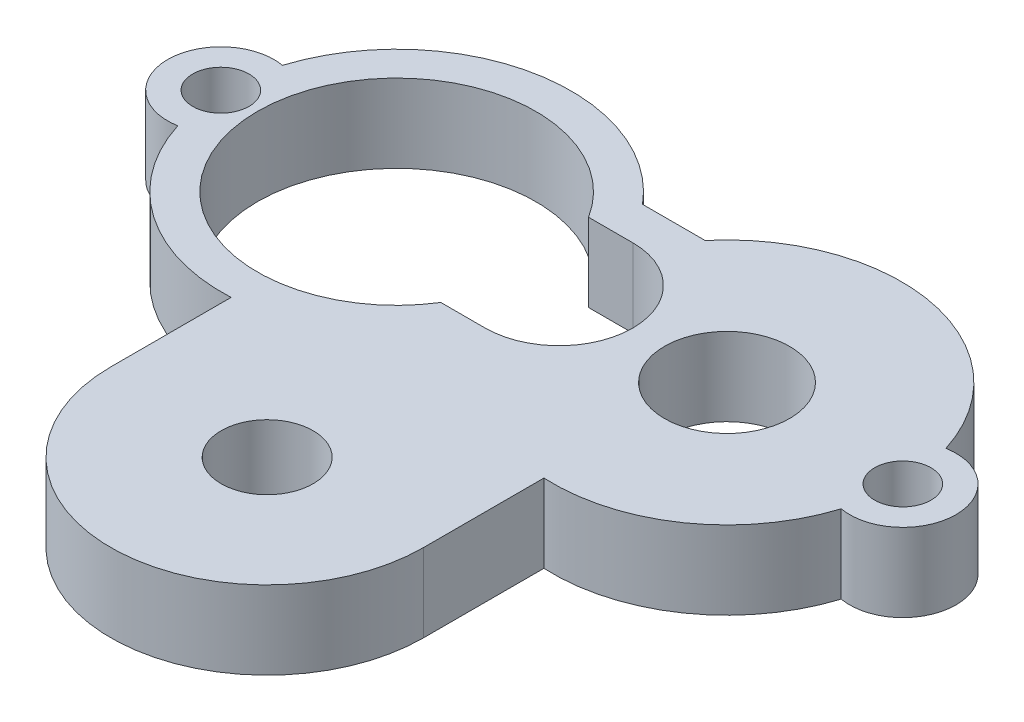
ISO-10303-21;
HEADER;
FILE_DESCRIPTION(('STEP AP214'),'2;1');
FILE_NAME('part.step','',(''),(''),'','','');
FILE_SCHEMA(('AUTOMOTIVE_DESIGN { 1 0 10303 214 1 1 1 1 }'));
ENDSEC;
DATA;
#1=APPLICATION_CONTEXT('core data for automotive mechanical design processes');
#2=APPLICATION_PROTOCOL_DEFINITION('international standard','automotive_design',2000,#1);
#3=PRODUCT_CONTEXT('',#1,'mechanical');
#4=PRODUCT('Part','Part','',(#3));
#5=PRODUCT_RELATED_PRODUCT_CATEGORY('part','',(#4));
#6=PRODUCT_DEFINITION_FORMATION('','',#4);
#7=PRODUCT_DEFINITION_CONTEXT('part definition',#1,'design');
#8=PRODUCT_DEFINITION('design','',#6,#7);
#9=PRODUCT_DEFINITION_SHAPE('','',#8);
#10=(LENGTH_UNIT() NAMED_UNIT(*) SI_UNIT(.MILLI.,.METRE.));
#11=(NAMED_UNIT(*) PLANE_ANGLE_UNIT() SI_UNIT($,.RADIAN.));
#12=(NAMED_UNIT(*) SI_UNIT($,.STERADIAN.) SOLID_ANGLE_UNIT());
#13=UNCERTAINTY_MEASURE_WITH_UNIT(LENGTH_MEASURE(1.E-05),#10,'distance_accuracy_value','');
#14=(GEOMETRIC_REPRESENTATION_CONTEXT(3) GLOBAL_UNCERTAINTY_ASSIGNED_CONTEXT((#13)) GLOBAL_UNIT_ASSIGNED_CONTEXT((#10,
#11,#12)) REPRESENTATION_CONTEXT('',''));
#15=CARTESIAN_POINT('',(0.,0.,0.));
#16=DIRECTION('',(0.,0.,1.));
#17=DIRECTION('',(1.,0.,0.));
#18=AXIS2_PLACEMENT_3D('',#15,#16,#17);
#19=CARTESIAN_POINT('',(13.843,3.175,-11.9634));
#20=DIRECTION('',(0.,-1.,0.));
#21=DIRECTION('',(0.,0.,-1.));
#22=AXIS2_PLACEMENT_3D('',#19,#20,#21);
#23=CYLINDRICAL_SURFACE('',#22,2.159);
#24=CARTESIAN_POINT('',(13.843,0.,-11.9634));
#25=DIRECTION('',(0.,1.,0.));
#26=DIRECTION('',(0.,0.,1.));
#27=AXIS2_PLACEMENT_3D('',#24,#25,#26);
#28=CIRCLE('',#27,2.159);
#29=CARTESIAN_POINT('',(13.4660664748785,0.,-14.0892415081185));
#30=VERTEX_POINT('',#29);
#31=CARTESIAN_POINT('',(13.4660664748786,0.,-9.83755849188153));
#32=VERTEX_POINT('',#31);
#33=EDGE_CURVE('E223',#30,#32,#28,.F.);
#34=ORIENTED_EDGE('',*,*,#33,.F.);
#35=DIRECTION('',(0.,-1.,0.));
#36=VECTOR('',#35,1.);
#37=CARTESIAN_POINT('',(13.4660664748785,3.175,-14.0892415081185));
#38=LINE('',#37,#36);
#39=CARTESIAN_POINT('',(13.4660664748785,3.175,-14.0892415081185));
#40=VERTEX_POINT('',#39);
#41=EDGE_CURVE('E11',#40,#30,#38,.T.);
#42=ORIENTED_EDGE('',*,*,#41,.F.);
#43=CARTESIAN_POINT('',(13.843,3.175,-11.9634));
#44=DIRECTION('',(0.,1.,0.));
#45=DIRECTION('',(0.,0.,1.));
#46=AXIS2_PLACEMENT_3D('',#43,#44,#45);
#47=CIRCLE('',#46,2.159);
#48=CARTESIAN_POINT('',(13.4660664748786,3.175,-9.83755849188153));
#49=VERTEX_POINT('',#48);
#50=EDGE_CURVE('E187',#40,#49,#47,.F.);
#51=ORIENTED_EDGE('',*,*,#50,.T.);
#52=DIRECTION('',(0.,-1.,0.));
#53=VECTOR('',#52,1.);
#54=CARTESIAN_POINT('',(13.4660664748786,3.175,-9.83755849188153));
#55=LINE('',#54,#53);
#56=EDGE_CURVE('E214',#49,#32,#55,.T.);
#57=ORIENTED_EDGE('',*,*,#56,.T.);
#58=EDGE_LOOP('',(#34,#42,#51,#57));
#59=FACE_BOUND('',#58,.T.);
#60=ADVANCED_FACE('F36',(#59),#23,.T.);
#61=CARTESIAN_POINT('',(6.70583737799431,3.175,-11.9634));
#62=DIRECTION('',(0.,-1.,0.));
#63=DIRECTION('',(0.,0.,-1.));
#64=AXIS2_PLACEMENT_3D('',#61,#62,#63);
#65=CYLINDRICAL_SURFACE('',#64,7.0866);
#66=CARTESIAN_POINT('',(6.70583737799431,0.,-11.9634));
#67=DIRECTION('',(0.,1.,0.));
#68=DIRECTION('',(0.,0.,1.));
#69=AXIS2_PLACEMENT_3D('',#66,#67,#68);
#70=CIRCLE('',#69,7.0866);
#71=CARTESIAN_POINT('',(1.27,0.,-16.51));
#72=VERTEX_POINT('',#71);
#73=EDGE_CURVE('E226',#30,#72,#70,.T.);
#74=ORIENTED_EDGE('',*,*,#73,.T.);
#75=DIRECTION('',(0.,-1.,0.));
#76=VECTOR('',#75,1.);
#77=CARTESIAN_POINT('',(1.27,3.175,-16.51));
#78=LINE('',#77,#76);
#79=CARTESIAN_POINT('',(1.27,3.175,-16.51));
#80=VERTEX_POINT('',#79);
#81=EDGE_CURVE('E44',#80,#72,#78,.T.);
#82=ORIENTED_EDGE('',*,*,#81,.F.);
#83=CARTESIAN_POINT('',(6.70583737799431,3.175,-11.9634));
#84=DIRECTION('',(0.,1.,0.));
#85=DIRECTION('',(0.,0.,1.));
#86=AXIS2_PLACEMENT_3D('',#83,#84,#85);
#87=CIRCLE('',#86,7.0866);
#88=EDGE_CURVE('E190',#40,#80,#87,.T.);
#89=ORIENTED_EDGE('',*,*,#88,.F.);
#90=ORIENTED_EDGE('',*,*,#41,.T.);
#91=EDGE_LOOP('',(#74,#82,#89,#90));
#92=FACE_BOUND('',#91,.T.);
#93=ADVANCED_FACE('F276',(#92),#65,.T.);
#94=CARTESIAN_POINT('',(0.,3.175,-16.51));
#95=DIRECTION('',(0.,0.,-1.));
#96=DIRECTION('',(-1.,0.,0.));
#97=AXIS2_PLACEMENT_3D('',#94,#95,#96);
#98=PLANE('',#97);
#99=DIRECTION('',(1.,0.,0.));
#100=VECTOR('',#99,1.);
#101=CARTESIAN_POINT('',(0.,0.,-16.51));
#102=LINE('',#101,#100);
#103=CARTESIAN_POINT('',(-1.27,0.,-16.51));
#104=VERTEX_POINT('',#103);
#105=EDGE_CURVE('E229',#104,#72,#102,.T.);
#106=ORIENTED_EDGE('',*,*,#105,.F.);
#107=DIRECTION('',(0.,-1.,0.));
#108=VECTOR('',#107,1.);
#109=CARTESIAN_POINT('',(-1.27,3.175,-16.51));
#110=LINE('',#109,#108);
#111=CARTESIAN_POINT('',(-1.27,3.175,-16.51));
#112=VERTEX_POINT('',#111);
#113=EDGE_CURVE('E267',#112,#104,#110,.T.);
#114=ORIENTED_EDGE('',*,*,#113,.F.);
#115=DIRECTION('',(1.,0.,0.));
#116=VECTOR('',#115,1.);
#117=CARTESIAN_POINT('',(0.,3.175,-16.51));
#118=LINE('',#117,#116);
#119=EDGE_CURVE('E192',#112,#80,#118,.T.);
#120=ORIENTED_EDGE('',*,*,#119,.T.);
#121=ORIENTED_EDGE('',*,*,#81,.T.);
#122=EDGE_LOOP('',(#106,#114,#120,#121));
#123=FACE_BOUND('',#122,.T.);
#124=ADVANCED_FACE('F271',(#123),#98,.T.);
#125=CARTESIAN_POINT('',(-6.70583737799431,3.175,-11.9634));
#126=DIRECTION('',(0.,-1.,0.));
#127=DIRECTION('',(0.,0.,-1.));
#128=AXIS2_PLACEMENT_3D('',#125,#126,#127);
#129=CYLINDRICAL_SURFACE('',#128,7.0866);
#130=CARTESIAN_POINT('',(-6.70583737799431,0.,-11.9634));
#131=DIRECTION('',(0.,1.,0.));
#132=DIRECTION('',(0.,0.,1.));
#133=AXIS2_PLACEMENT_3D('',#130,#131,#132);
#134=CIRCLE('',#133,7.0866);
#135=CARTESIAN_POINT('',(-13.4660664748785,0.,-14.0892415081185));
#136=VERTEX_POINT('',#135);
#137=EDGE_CURVE('E232',#136,#104,#134,.F.);
#138=ORIENTED_EDGE('',*,*,#137,.F.);
#139=DIRECTION('',(0.,-1.,0.));
#140=VECTOR('',#139,1.);
#141=CARTESIAN_POINT('',(-13.4660664748785,3.175,-14.0892415081185));
#142=LINE('',#141,#140);
#143=CARTESIAN_POINT('',(-13.4660664748785,3.175,-14.0892415081185));
#144=VERTEX_POINT('',#143);
#145=EDGE_CURVE('E265',#144,#136,#142,.T.);
#146=ORIENTED_EDGE('',*,*,#145,.F.);
#147=CARTESIAN_POINT('',(-6.70583737799431,3.175,-11.9634));
#148=DIRECTION('',(0.,1.,0.));
#149=DIRECTION('',(0.,0.,1.));
#150=AXIS2_PLACEMENT_3D('',#147,#148,#149);
#151=CIRCLE('',#150,7.0866);
#152=EDGE_CURVE('E195',#144,#112,#151,.F.);
#153=ORIENTED_EDGE('',*,*,#152,.T.);
#154=ORIENTED_EDGE('',*,*,#113,.T.);
#155=EDGE_LOOP('',(#138,#146,#153,#154));
#156=FACE_BOUND('',#155,.T.);
#157=ADVANCED_FACE('F282',(#156),#129,.T.);
#158=CARTESIAN_POINT('',(-13.843,3.175,-11.9634));
#159=DIRECTION('',(0.,-1.,0.));
#160=DIRECTION('',(0.,0.,-1.));
#161=AXIS2_PLACEMENT_3D('',#158,#159,#160);
#162=CYLINDRICAL_SURFACE('',#161,2.159);
#163=CARTESIAN_POINT('',(-13.843,0.,-11.9634));
#164=DIRECTION('',(0.,1.,0.));
#165=DIRECTION('',(0.,0.,1.));
#166=AXIS2_PLACEMENT_3D('',#163,#164,#165);
#167=CIRCLE('',#166,2.159);
#168=CARTESIAN_POINT('',(-13.4660664748786,0.,-9.83755849188152));
#169=VERTEX_POINT('',#168);
#170=EDGE_CURVE('E235',#136,#169,#167,.T.);
#171=ORIENTED_EDGE('',*,*,#170,.T.);
#172=DIRECTION('',(0.,-1.,0.));
#173=VECTOR('',#172,1.);
#174=CARTESIAN_POINT('',(-13.4660664748786,3.175,-9.83755849188152));
#175=LINE('',#174,#173);
#176=CARTESIAN_POINT('',(-13.4660664748786,3.175,-9.83755849188152));
#177=VERTEX_POINT('',#176);
#178=EDGE_CURVE('E263',#177,#169,#175,.T.);
#179=ORIENTED_EDGE('',*,*,#178,.F.);
#180=CARTESIAN_POINT('',(-13.843,3.175,-11.9634));
#181=DIRECTION('',(0.,1.,0.));
#182=DIRECTION('',(0.,0.,1.));
#183=AXIS2_PLACEMENT_3D('',#180,#181,#182);
#184=CIRCLE('',#183,2.159);
#185=EDGE_CURVE('E198',#144,#177,#184,.T.);
#186=ORIENTED_EDGE('',*,*,#185,.F.);
#187=ORIENTED_EDGE('',*,*,#145,.T.);
#188=EDGE_LOOP('',(#171,#179,#186,#187));
#189=FACE_BOUND('',#188,.T.);
#190=ADVANCED_FACE('F310',(#189),#162,.T.);
#191=CARTESIAN_POINT('',(-6.70583737799431,3.175,-11.9634));
#192=DIRECTION('',(0.,-1.,0.));
#193=DIRECTION('',(0.,0.,-1.));
#194=AXIS2_PLACEMENT_3D('',#191,#192,#193);
#195=CYLINDRICAL_SURFACE('',#194,7.0866);
#196=CARTESIAN_POINT('',(-6.70583737799431,0.,-11.9634));
#197=DIRECTION('',(0.,1.,0.));
#198=DIRECTION('',(0.,0.,1.));
#199=AXIS2_PLACEMENT_3D('',#196,#197,#198);
#200=CIRCLE('',#199,7.0866);
#201=CARTESIAN_POINT('',(-6.35,0.,-4.88573941754606));
#202=VERTEX_POINT('',#201);
#203=EDGE_CURVE('E238',#202,#169,#200,.F.);
#204=ORIENTED_EDGE('',*,*,#203,.F.);
#205=DIRECTION('',(0.,-1.,0.));
#206=VECTOR('',#205,1.);
#207=CARTESIAN_POINT('',(-6.35,3.175,-4.88573941754606));
#208=LINE('',#207,#206);
#209=CARTESIAN_POINT('',(-6.35,3.175,-4.88573941754606));
#210=VERTEX_POINT('',#209);
#211=EDGE_CURVE('E261',#210,#202,#208,.T.);
#212=ORIENTED_EDGE('',*,*,#211,.F.);
#213=CARTESIAN_POINT('',(-6.70583737799431,3.175,-11.9634));
#214=DIRECTION('',(0.,1.,0.));
#215=DIRECTION('',(0.,0.,1.));
#216=AXIS2_PLACEMENT_3D('',#213,#214,#215);
#217=CIRCLE('',#216,7.0866);
#218=EDGE_CURVE('E200',#210,#177,#217,.F.);
#219=ORIENTED_EDGE('',*,*,#218,.T.);
#220=ORIENTED_EDGE('',*,*,#178,.T.);
#221=EDGE_LOOP('',(#204,#212,#219,#220));
#222=FACE_BOUND('',#221,.T.);
#223=ADVANCED_FACE('F307',(#222),#195,.T.);
#224=CARTESIAN_POINT('',(-6.35,3.175,0.));
#225=DIRECTION('',(-1.,0.,0.));
#226=DIRECTION('',(0.,0.,1.));
#227=AXIS2_PLACEMENT_3D('',#224,#225,#226);
#228=PLANE('',#227);
#229=DIRECTION('',(0.,0.,-1.));
#230=VECTOR('',#229,1.);
#231=CARTESIAN_POINT('',(-6.35,0.,0.));
#232=LINE('',#231,#230);
#233=CARTESIAN_POINT('',(-6.35,0.,0.));
#234=VERTEX_POINT('',#233);
#235=EDGE_CURVE('E241',#234,#202,#232,.T.);
#236=ORIENTED_EDGE('',*,*,#235,.F.);
#237=DIRECTION('',(0.,-1.,0.));
#238=VECTOR('',#237,1.);
#239=CARTESIAN_POINT('',(-6.35,3.175,0.));
#240=LINE('',#239,#238);
#241=CARTESIAN_POINT('',(-6.35,3.175,0.));
#242=VERTEX_POINT('',#241);
#243=EDGE_CURVE('E259',#242,#234,#240,.T.);
#244=ORIENTED_EDGE('',*,*,#243,.F.);
#245=DIRECTION('',(0.,0.,-1.));
#246=VECTOR('',#245,1.);
#247=CARTESIAN_POINT('',(-6.35,3.175,0.));
#248=LINE('',#247,#246);
#249=EDGE_CURVE('E203',#242,#210,#248,.T.);
#250=ORIENTED_EDGE('',*,*,#249,.T.);
#251=ORIENTED_EDGE('',*,*,#211,.T.);
#252=EDGE_LOOP('',(#236,#244,#250,#251));
#253=FACE_BOUND('',#252,.T.);
#254=ADVANCED_FACE('F302',(#253),#228,.T.);
#255=CARTESIAN_POINT('',(0.,3.175,0.));
#256=DIRECTION('',(0.,-1.,0.));
#257=DIRECTION('',(0.,0.,-1.));
#258=AXIS2_PLACEMENT_3D('',#255,#256,#257);
#259=CYLINDRICAL_SURFACE('',#258,6.35);
#260=CARTESIAN_POINT('',(0.,0.,0.));
#261=DIRECTION('',(0.,1.,0.));
#262=DIRECTION('',(0.,0.,1.));
#263=AXIS2_PLACEMENT_3D('',#260,#261,#262);
#264=CIRCLE('',#263,6.35);
#265=CARTESIAN_POINT('',(6.35,0.,0.));
#266=VERTEX_POINT('',#265);
#267=EDGE_CURVE('E244',#234,#266,#264,.T.);
#268=ORIENTED_EDGE('',*,*,#267,.T.);
#269=DIRECTION('',(0.,-1.,0.));
#270=VECTOR('',#269,1.);
#271=CARTESIAN_POINT('',(6.35,3.175,0.));
#272=LINE('',#271,#270);
#273=CARTESIAN_POINT('',(6.35,3.175,0.));
#274=VERTEX_POINT('',#273);
#275=EDGE_CURVE('E256',#274,#266,#272,.T.);
#276=ORIENTED_EDGE('',*,*,#275,.F.);
#277=CARTESIAN_POINT('',(0.,3.175,0.));
#278=DIRECTION('',(0.,1.,0.));
#279=DIRECTION('',(0.,0.,1.));
#280=AXIS2_PLACEMENT_3D('',#277,#278,#279);
#281=CIRCLE('',#280,6.35);
#282=EDGE_CURVE('E206',#242,#274,#281,.T.);
#283=ORIENTED_EDGE('',*,*,#282,.F.);
#284=ORIENTED_EDGE('',*,*,#243,.T.);
#285=EDGE_LOOP('',(#268,#276,#283,#284));
#286=FACE_BOUND('',#285,.T.);
#287=ADVANCED_FACE('F299',(#286),#259,.T.);
#288=CARTESIAN_POINT('',(6.35,3.175,0.));
#289=DIRECTION('',(-1.,0.,0.));
#290=DIRECTION('',(0.,0.,1.));
#291=AXIS2_PLACEMENT_3D('',#288,#289,#290);
#292=PLANE('',#291);
#293=DIRECTION('',(0.,0.,-1.));
#294=VECTOR('',#293,1.);
#295=CARTESIAN_POINT('',(6.35,0.,0.));
#296=LINE('',#295,#294);
#297=CARTESIAN_POINT('',(6.35,0.,-4.88573941754606));
#298=VERTEX_POINT('',#297);
#299=EDGE_CURVE('E247',#266,#298,#296,.T.);
#300=ORIENTED_EDGE('',*,*,#299,.T.);
#301=DIRECTION('',(0.,-1.,0.));
#302=VECTOR('',#301,1.);
#303=CARTESIAN_POINT('',(6.35,3.175,-4.88573941754606));
#304=LINE('',#303,#302);
#305=CARTESIAN_POINT('',(6.35,3.175,-4.88573941754606));
#306=VERTEX_POINT('',#305);
#307=EDGE_CURVE('E253',#306,#298,#304,.T.);
#308=ORIENTED_EDGE('',*,*,#307,.F.);
#309=DIRECTION('',(0.,0.,-1.));
#310=VECTOR('',#309,1.);
#311=CARTESIAN_POINT('',(6.35,3.175,0.));
#312=LINE('',#311,#310);
#313=EDGE_CURVE('E209',#274,#306,#312,.T.);
#314=ORIENTED_EDGE('',*,*,#313,.F.);
#315=ORIENTED_EDGE('',*,*,#275,.T.);
#316=EDGE_LOOP('',(#300,#308,#314,#315));
#317=FACE_BOUND('',#316,.T.);
#318=ADVANCED_FACE('F295',(#317),#292,.F.);
#319=CARTESIAN_POINT('',(0.,3.175,0.));
#320=DIRECTION('',(0.,-1.,0.));
#321=DIRECTION('',(0.,0.,-1.));
#322=AXIS2_PLACEMENT_3D('',#319,#320,#321);
#323=CYLINDRICAL_SURFACE('',#322,1.8669);
#324=CARTESIAN_POINT('',(0.,3.175,0.));
#325=DIRECTION('',(0.,1.,0.));
#326=DIRECTION('',(0.,0.,1.));
#327=AXIS2_PLACEMENT_3D('',#324,#325,#326);
#328=CIRCLE('',#327,1.8669);
#329=CARTESIAN_POINT('',(0.,3.175,1.8669));
#330=VERTEX_POINT('',#329);
#331=EDGE_CURVE('E184',#330,#330,#328,.T.);
#332=ORIENTED_EDGE('',*,*,#331,.T.);
#333=EDGE_LOOP('',(#332));
#334=FACE_BOUND('',#333,.T.);
#335=CARTESIAN_POINT('',(0.,0.,0.));
#336=DIRECTION('',(0.,1.,0.));
#337=DIRECTION('',(0.,0.,1.));
#338=AXIS2_PLACEMENT_3D('',#335,#336,#337);
#339=CIRCLE('',#338,1.8669);
#340=CARTESIAN_POINT('',(0.,0.,1.8669));
#341=VERTEX_POINT('',#340);
#342=EDGE_CURVE('E220',#341,#341,#339,.T.);
#343=ORIENTED_EDGE('',*,*,#342,.F.);
#344=EDGE_LOOP('',(#343));
#345=FACE_BOUND('',#344,.T.);
#346=ADVANCED_FACE('F327',(#334,#345),#323,.F.);
#347=CARTESIAN_POINT('',(-13.843,3.175,-11.9634));
#348=DIRECTION('',(0.,-1.,0.));
#349=DIRECTION('',(0.,0.,-1.));
#350=AXIS2_PLACEMENT_3D('',#347,#348,#349);
#351=CYLINDRICAL_SURFACE('',#350,1.143);
#352=CARTESIAN_POINT('',(-13.843,3.175,-11.9634));
#353=DIRECTION('',(0.,1.,0.));
#354=DIRECTION('',(0.,0.,1.));
#355=AXIS2_PLACEMENT_3D('',#352,#353,#354);
#356=CIRCLE('',#355,1.143);
#357=CARTESIAN_POINT('',(-13.843,3.175,-10.8204));
#358=VERTEX_POINT('',#357);
#359=EDGE_CURVE('E180',#358,#358,#356,.T.);
#360=ORIENTED_EDGE('',*,*,#359,.T.);
#361=EDGE_LOOP('',(#360));
#362=FACE_BOUND('',#361,.T.);
#363=CARTESIAN_POINT('',(-13.843,0.,-11.9634));
#364=DIRECTION('',(0.,1.,0.));
#365=DIRECTION('',(0.,0.,1.));
#366=AXIS2_PLACEMENT_3D('',#363,#364,#365);
#367=CIRCLE('',#366,1.143);
#368=CARTESIAN_POINT('',(-13.843,0.,-10.8204));
#369=VERTEX_POINT('',#368);
#370=EDGE_CURVE('E217',#369,#369,#367,.T.);
#371=ORIENTED_EDGE('',*,*,#370,.F.);
#372=EDGE_LOOP('',(#371));
#373=FACE_BOUND('',#372,.T.);
#374=ADVANCED_FACE('F329',(#362,#373),#351,.F.);
#375=CARTESIAN_POINT('',(13.843,3.175,-11.9634));
#376=DIRECTION('',(0.,-1.,0.));
#377=DIRECTION('',(0.,0.,-1.));
#378=AXIS2_PLACEMENT_3D('',#375,#376,#377);
#379=CYLINDRICAL_SURFACE('',#378,1.143);
#380=CARTESIAN_POINT('',(13.843,3.175,-11.9634));
#381=DIRECTION('',(0.,1.,0.));
#382=DIRECTION('',(0.,0.,1.));
#383=AXIS2_PLACEMENT_3D('',#380,#381,#382);
#384=CIRCLE('',#383,1.143);
#385=CARTESIAN_POINT('',(13.843,3.175,-10.8204));
#386=VERTEX_POINT('',#385);
#387=EDGE_CURVE('E177',#386,#386,#384,.F.);
#388=ORIENTED_EDGE('',*,*,#387,.F.);
#389=EDGE_LOOP('',(#388));
#390=FACE_BOUND('',#389,.T.);
#391=CARTESIAN_POINT('',(13.843,0.,-11.9634));
#392=DIRECTION('',(0.,1.,0.));
#393=DIRECTION('',(0.,0.,1.));
#394=AXIS2_PLACEMENT_3D('',#391,#392,#393);
#395=CIRCLE('',#394,1.143);
#396=CARTESIAN_POINT('',(13.843,0.,-10.8204));
#397=VERTEX_POINT('',#396);
#398=EDGE_CURVE('E173',#397,#397,#395,.F.);
#399=ORIENTED_EDGE('',*,*,#398,.T.);
#400=EDGE_LOOP('',(#399));
#401=FACE_BOUND('',#400,.T.);
#402=ADVANCED_FACE('F38',(#390,#401),#379,.F.);
#403=CARTESIAN_POINT('',(6.70583737799431,3.175,-11.9634));
#404=DIRECTION('',(0.,-1.,0.));
#405=DIRECTION('',(0.,0.,-1.));
#406=AXIS2_PLACEMENT_3D('',#403,#404,#405);
#407=CYLINDRICAL_SURFACE('',#406,7.0866);
#408=CARTESIAN_POINT('',(6.70583737799431,0.,-11.9634));
#409=DIRECTION('',(0.,1.,0.));
#410=DIRECTION('',(0.,0.,1.));
#411=AXIS2_PLACEMENT_3D('',#408,#409,#410);
#412=CIRCLE('',#411,7.0866);
#413=EDGE_CURVE('E181',#298,#32,#412,.T.);
#414=ORIENTED_EDGE('',*,*,#413,.T.);
#415=ORIENTED_EDGE('',*,*,#56,.F.);
#416=CARTESIAN_POINT('',(6.70583737799431,3.175,-11.9634));
#417=DIRECTION('',(0.,1.,0.));
#418=DIRECTION('',(0.,0.,1.));
#419=AXIS2_PLACEMENT_3D('',#416,#417,#418);
#420=CIRCLE('',#419,7.0866);
#421=EDGE_CURVE('E212',#306,#49,#420,.T.);
#422=ORIENTED_EDGE('',*,*,#421,.F.);
#423=ORIENTED_EDGE('',*,*,#307,.T.);
#424=EDGE_LOOP('',(#414,#415,#422,#423));
#425=FACE_BOUND('',#424,.T.);
#426=ADVANCED_FACE('F293',(#425),#407,.T.);
#427=CARTESIAN_POINT('',(0.,3.175,0.));
#428=DIRECTION('',(0.,1.,0.));
#429=DIRECTION('',(0.,0.,1.));
#430=AXIS2_PLACEMENT_3D('',#427,#428,#429);
#431=PLANE('',#430);
#432=CARTESIAN_POINT('',(6.70583737799431,3.175,-11.9634));
#433=DIRECTION('',(0.,1.,0.));
#434=DIRECTION('',(0.,0.,1.));
#435=AXIS2_PLACEMENT_3D('',#432,#433,#434);
#436=CIRCLE('',#435,2.54);
#437=CARTESIAN_POINT('',(6.70583737799431,3.175,-9.4234));
#438=VERTEX_POINT('',#437);
#439=EDGE_CURVE('E160',#438,#438,#436,.T.);
#440=ORIENTED_EDGE('',*,*,#439,.F.);
#441=EDGE_LOOP('',(#440));
#442=FACE_BOUND('',#441,.T.);
#443=CARTESIAN_POINT('',(-6.70583737799431,3.175,-11.9634));
#444=DIRECTION('',(0.,1.,0.));
#445=DIRECTION('',(0.,0.,1.));
#446=AXIS2_PLACEMENT_3D('',#443,#444,#445);
#447=CIRCLE('',#446,5.6515);
#448=CARTESIAN_POINT('',(-1.91456986198145,3.175,-14.9606));
#449=VERTEX_POINT('',#448);
#450=CARTESIAN_POINT('',(-1.91456986198145,3.175,-8.9662));
#451=VERTEX_POINT('',#450);
#452=EDGE_CURVE('E51',#449,#451,#447,.T.);
#453=ORIENTED_EDGE('',*,*,#452,.F.);
#454=DIRECTION('',(-1.,0.,0.));
#455=VECTOR('',#454,1.);
#456=CARTESIAN_POINT('',(-0.114537377994308,3.175,-14.9606));
#457=LINE('',#456,#455);
#458=CARTESIAN_POINT('',(-0.114537377994308,3.175,-14.9606));
#459=VERTEX_POINT('',#458);
#460=EDGE_CURVE('E154',#459,#449,#457,.T.);
#461=ORIENTED_EDGE('',*,*,#460,.F.);
#462=CARTESIAN_POINT('',(-0.114537377994308,3.175,-11.9634));
#463=DIRECTION('',(0.,1.,0.));
#464=DIRECTION('',(0.,0.,1.));
#465=AXIS2_PLACEMENT_3D('',#462,#463,#464);
#466=CIRCLE('',#465,2.9972);
#467=CARTESIAN_POINT('',(-0.114537377994308,3.175,-8.9662));
#468=VERTEX_POINT('',#467);
#469=EDGE_CURVE('E157',#468,#459,#466,.T.);
#470=ORIENTED_EDGE('',*,*,#469,.F.);
#471=DIRECTION('',(1.,0.,0.));
#472=VECTOR('',#471,1.);
#473=CARTESIAN_POINT('',(-0.114537377994308,3.175,-8.9662));
#474=LINE('',#473,#472);
#475=EDGE_CURVE('E166',#451,#468,#474,.T.);
#476=ORIENTED_EDGE('',*,*,#475,.F.);
#477=EDGE_LOOP('',(#453,#461,#470,#476));
#478=FACE_BOUND('',#477,.T.);
#479=ORIENTED_EDGE('',*,*,#387,.T.);
#480=EDGE_LOOP('',(#479));
#481=FACE_BOUND('',#480,.T.);
#482=ORIENTED_EDGE('',*,*,#359,.F.);
#483=EDGE_LOOP('',(#482));
#484=FACE_BOUND('',#483,.T.);
#485=ORIENTED_EDGE('',*,*,#331,.F.);
#486=EDGE_LOOP('',(#485));
#487=FACE_BOUND('',#486,.T.);
#488=ORIENTED_EDGE('',*,*,#50,.F.);
#489=ORIENTED_EDGE('',*,*,#88,.T.);
#490=ORIENTED_EDGE('',*,*,#119,.F.);
#491=ORIENTED_EDGE('',*,*,#152,.F.);
#492=ORIENTED_EDGE('',*,*,#185,.T.);
#493=ORIENTED_EDGE('',*,*,#218,.F.);
#494=ORIENTED_EDGE('',*,*,#249,.F.);
#495=ORIENTED_EDGE('',*,*,#282,.T.);
#496=ORIENTED_EDGE('',*,*,#313,.T.);
#497=ORIENTED_EDGE('',*,*,#421,.T.);
#498=EDGE_LOOP('',(#488,#489,#490,#491,#492,#493,#494,#495,#496,#497));
#499=FACE_BOUND('',#498,.T.);
#500=ADVANCED_FACE('F287',(#442,#478,#481,#484,#487,#499),#431,.T.);
#501=CARTESIAN_POINT('',(0.,0.,0.));
#502=DIRECTION('',(0.,1.,0.));
#503=DIRECTION('',(0.,0.,1.));
#504=AXIS2_PLACEMENT_3D('',#501,#502,#503);
#505=PLANE('',#504);
#506=CARTESIAN_POINT('',(6.70583737799431,0.,-11.9634));
#507=DIRECTION('',(0.,1.,0.));
#508=DIRECTION('',(0.,0.,1.));
#509=AXIS2_PLACEMENT_3D('',#506,#507,#508);
#510=CIRCLE('',#509,2.54);
#511=CARTESIAN_POINT('',(6.70583737799431,0.,-9.4234));
#512=VERTEX_POINT('',#511);
#513=EDGE_CURVE('E167',#512,#512,#510,.T.);
#514=ORIENTED_EDGE('',*,*,#513,.T.);
#515=EDGE_LOOP('',(#514));
#516=FACE_BOUND('',#515,.T.);
#517=DIRECTION('',(-1.,0.,0.));
#518=VECTOR('',#517,1.);
#519=CARTESIAN_POINT('',(-0.114537377994308,0.,-14.9606));
#520=LINE('',#519,#518);
#521=CARTESIAN_POINT('',(-0.114537377994308,0.,-14.9606));
#522=VERTEX_POINT('',#521);
#523=CARTESIAN_POINT('',(-1.91456986198145,0.,-14.9606));
#524=VERTEX_POINT('',#523);
#525=EDGE_CURVE('E144',#522,#524,#520,.T.);
#526=ORIENTED_EDGE('',*,*,#525,.T.);
#527=CARTESIAN_POINT('',(-6.70583737799431,0.,-11.9634));
#528=DIRECTION('',(0.,1.,0.));
#529=DIRECTION('',(0.,0.,1.));
#530=AXIS2_PLACEMENT_3D('',#527,#528,#529);
#531=CIRCLE('',#530,5.6515);
#532=CARTESIAN_POINT('',(-1.91456986198145,0.,-8.9662));
#533=VERTEX_POINT('',#532);
#534=EDGE_CURVE('E138',#524,#533,#531,.T.);
#535=ORIENTED_EDGE('',*,*,#534,.T.);
#536=DIRECTION('',(1.,0.,0.));
#537=VECTOR('',#536,1.);
#538=CARTESIAN_POINT('',(-0.114537377994308,0.,-8.9662));
#539=LINE('',#538,#537);
#540=CARTESIAN_POINT('',(-0.114537377994308,0.,-8.9662));
#541=VERTEX_POINT('',#540);
#542=EDGE_CURVE('E147',#533,#541,#539,.T.);
#543=ORIENTED_EDGE('',*,*,#542,.T.);
#544=CARTESIAN_POINT('',(-0.114537377994308,0.,-11.9634));
#545=DIRECTION('',(0.,1.,0.));
#546=DIRECTION('',(0.,0.,1.));
#547=AXIS2_PLACEMENT_3D('',#544,#545,#546);
#548=CIRCLE('',#547,2.9972);
#549=EDGE_CURVE('E59',#541,#522,#548,.T.);
#550=ORIENTED_EDGE('',*,*,#549,.T.);
#551=EDGE_LOOP('',(#526,#535,#543,#550));
#552=FACE_BOUND('',#551,.T.);
#553=ORIENTED_EDGE('',*,*,#398,.F.);
#554=EDGE_LOOP('',(#553));
#555=FACE_BOUND('',#554,.T.);
#556=ORIENTED_EDGE('',*,*,#370,.T.);
#557=EDGE_LOOP('',(#556));
#558=FACE_BOUND('',#557,.T.);
#559=ORIENTED_EDGE('',*,*,#342,.T.);
#560=EDGE_LOOP('',(#559));
#561=FACE_BOUND('',#560,.T.);
#562=ORIENTED_EDGE('',*,*,#33,.T.);
#563=ORIENTED_EDGE('',*,*,#413,.F.);
#564=ORIENTED_EDGE('',*,*,#299,.F.);
#565=ORIENTED_EDGE('',*,*,#267,.F.);
#566=ORIENTED_EDGE('',*,*,#235,.T.);
#567=ORIENTED_EDGE('',*,*,#203,.T.);
#568=ORIENTED_EDGE('',*,*,#170,.F.);
#569=ORIENTED_EDGE('',*,*,#137,.T.);
#570=ORIENTED_EDGE('',*,*,#105,.T.);
#571=ORIENTED_EDGE('',*,*,#73,.F.);
#572=EDGE_LOOP('',(#562,#563,#564,#565,#566,#567,#568,#569,#570,#571));
#573=FACE_BOUND('',#572,.T.);
#574=ADVANCED_FACE('F151',(#516,#552,#555,#558,#561,#573),#505,.F.);
#575=CARTESIAN_POINT('',(-6.70583737799431,0.,-11.9634));
#576=DIRECTION('',(0.,1.,0.));
#577=DIRECTION('',(0.,0.,1.));
#578=AXIS2_PLACEMENT_3D('',#575,#576,#577);
#579=CYLINDRICAL_SURFACE('',#578,5.6515);
#580=ORIENTED_EDGE('',*,*,#452,.T.);
#581=DIRECTION('',(0.,1.,0.));
#582=VECTOR('',#581,1.);
#583=CARTESIAN_POINT('',(-1.91456986198145,0.,-8.9662));
#584=LINE('',#583,#582);
#585=EDGE_CURVE('E134',#533,#451,#584,.T.);
#586=ORIENTED_EDGE('',*,*,#585,.F.);
#587=ORIENTED_EDGE('',*,*,#534,.F.);
#588=DIRECTION('',(0.,1.,0.));
#589=VECTOR('',#588,1.);
#590=CARTESIAN_POINT('',(-1.91456986198145,0.,-14.9606));
#591=LINE('',#590,#589);
#592=EDGE_CURVE('E171',#524,#449,#591,.T.);
#593=ORIENTED_EDGE('',*,*,#592,.T.);
#594=EDGE_LOOP('',(#580,#586,#587,#593));
#595=FACE_BOUND('',#594,.T.);
#596=ADVANCED_FACE('F136',(#595),#579,.F.);
#597=CARTESIAN_POINT('',(-0.114537377994308,0.,-14.9606));
#598=DIRECTION('',(0.,0.,-1.));
#599=DIRECTION('',(-1.,0.,0.));
#600=AXIS2_PLACEMENT_3D('',#597,#598,#599);
#601=PLANE('',#600);
#602=ORIENTED_EDGE('',*,*,#460,.T.);
#603=ORIENTED_EDGE('',*,*,#592,.F.);
#604=ORIENTED_EDGE('',*,*,#525,.F.);
#605=DIRECTION('',(0.,1.,0.));
#606=VECTOR('',#605,1.);
#607=CARTESIAN_POINT('',(-0.114537377994308,0.,-14.9606));
#608=LINE('',#607,#606);
#609=EDGE_CURVE('E174',#522,#459,#608,.T.);
#610=ORIENTED_EDGE('',*,*,#609,.T.);
#611=EDGE_LOOP('',(#602,#603,#604,#610));
#612=FACE_BOUND('',#611,.T.);
#613=ADVANCED_FACE('F351',(#612),#601,.F.);
#614=CARTESIAN_POINT('',(-0.114537377994308,0.,-11.9634));
#615=DIRECTION('',(0.,1.,0.));
#616=DIRECTION('',(0.,0.,1.));
#617=AXIS2_PLACEMENT_3D('',#614,#615,#616);
#618=CYLINDRICAL_SURFACE('',#617,2.9972);
#619=ORIENTED_EDGE('',*,*,#469,.T.);
#620=ORIENTED_EDGE('',*,*,#609,.F.);
#621=ORIENTED_EDGE('',*,*,#549,.F.);
#622=DIRECTION('',(0.,1.,0.));
#623=VECTOR('',#622,1.);
#624=CARTESIAN_POINT('',(-0.114537377994308,0.,-8.9662));
#625=LINE('',#624,#623);
#626=EDGE_CURVE('E143',#541,#468,#625,.T.);
#627=ORIENTED_EDGE('',*,*,#626,.T.);
#628=EDGE_LOOP('',(#619,#620,#621,#627));
#629=FACE_BOUND('',#628,.T.);
#630=ADVANCED_FACE('F422',(#629),#618,.F.);
#631=CARTESIAN_POINT('',(-0.114537377994308,0.,-8.9662));
#632=DIRECTION('',(0.,0.,1.));
#633=DIRECTION('',(1.,0.,0.));
#634=AXIS2_PLACEMENT_3D('',#631,#632,#633);
#635=PLANE('',#634);
#636=ORIENTED_EDGE('',*,*,#475,.T.);
#637=ORIENTED_EDGE('',*,*,#626,.F.);
#638=ORIENTED_EDGE('',*,*,#542,.F.);
#639=ORIENTED_EDGE('',*,*,#585,.T.);
#640=EDGE_LOOP('',(#636,#637,#638,#639));
#641=FACE_BOUND('',#640,.T.);
#642=ADVANCED_FACE('F148',(#641),#635,.F.);
#643=CARTESIAN_POINT('',(6.70583737799431,0.,-11.9634));
#644=DIRECTION('',(0.,1.,0.));
#645=DIRECTION('',(0.,0.,1.));
#646=AXIS2_PLACEMENT_3D('',#643,#644,#645);
#647=CYLINDRICAL_SURFACE('',#646,2.54);
#648=ORIENTED_EDGE('',*,*,#513,.F.);
#649=EDGE_LOOP('',(#648));
#650=FACE_BOUND('',#649,.T.);
#651=ORIENTED_EDGE('',*,*,#439,.T.);
#652=EDGE_LOOP('',(#651));
#653=FACE_BOUND('',#652,.T.);
#654=ADVANCED_FACE('F440',(#650,#653),#647,.F.);
#655=CLOSED_SHELL('',(#60,#93,#124,#157,#190,#223,#254,#287,#318,#346,#374,#402,#426,#500,#574,
#596,#613,#630,#642,#654));
#656=MANIFOLD_SOLID_BREP('B2',#655);
#657=ADVANCED_BREP_SHAPE_REPRESENTATION('',(#18,#656),#14);
#658=SHAPE_DEFINITION_REPRESENTATION(#9,#657);
ENDSEC;
END-ISO-10303-21;
